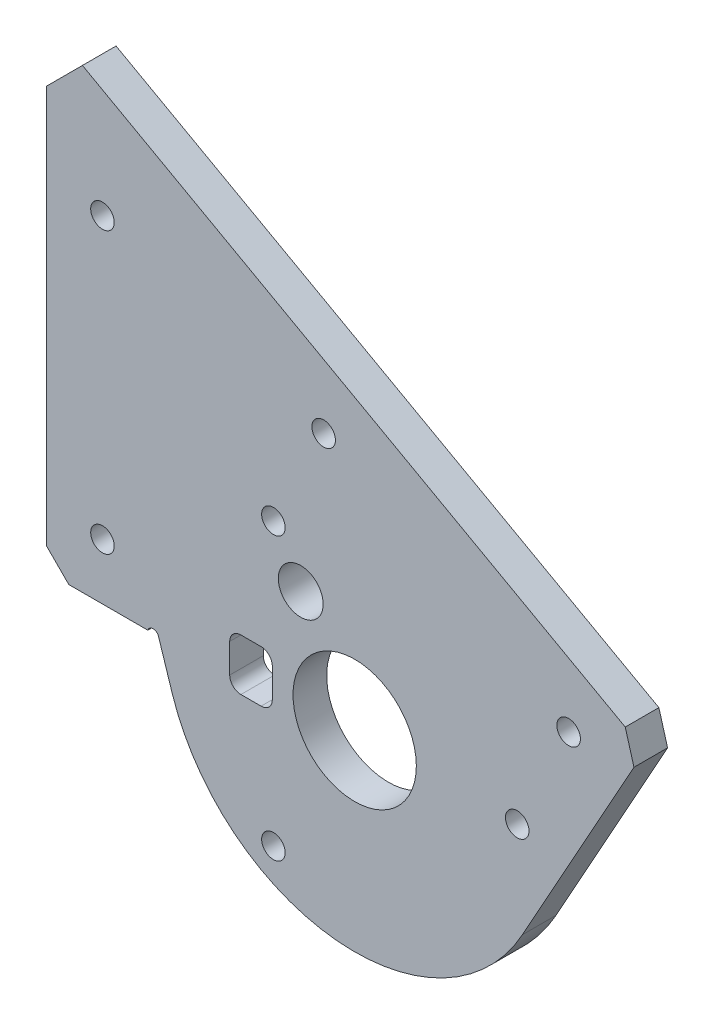
ISO-10303-21;
HEADER;
FILE_DESCRIPTION(('STEP AP214'),'2;1');
FILE_NAME('part.step','',(''),(''),'','','');
FILE_SCHEMA(('AUTOMOTIVE_DESIGN { 1 0 10303 214 1 1 1 1 }'));
ENDSEC;
DATA;
#1=APPLICATION_CONTEXT('core data for automotive mechanical design processes');
#2=APPLICATION_PROTOCOL_DEFINITION('international standard','automotive_design',2000,#1);
#3=PRODUCT_CONTEXT('',#1,'mechanical');
#4=PRODUCT('Part','Part','',(#3));
#5=PRODUCT_RELATED_PRODUCT_CATEGORY('part','',(#4));
#6=PRODUCT_DEFINITION_FORMATION('','',#4);
#7=PRODUCT_DEFINITION_CONTEXT('part definition',#1,'design');
#8=PRODUCT_DEFINITION('design','',#6,#7);
#9=PRODUCT_DEFINITION_SHAPE('','',#8);
#10=(LENGTH_UNIT() NAMED_UNIT(*) SI_UNIT(.MILLI.,.METRE.));
#11=(NAMED_UNIT(*) PLANE_ANGLE_UNIT() SI_UNIT($,.RADIAN.));
#12=(NAMED_UNIT(*) SI_UNIT($,.STERADIAN.) SOLID_ANGLE_UNIT());
#13=UNCERTAINTY_MEASURE_WITH_UNIT(LENGTH_MEASURE(1.E-05),#10,'distance_accuracy_value','');
#14=(GEOMETRIC_REPRESENTATION_CONTEXT(3) GLOBAL_UNCERTAINTY_ASSIGNED_CONTEXT((#13)) GLOBAL_UNIT_ASSIGNED_CONTEXT((#10,
#11,#12)) REPRESENTATION_CONTEXT('',''));
#15=CARTESIAN_POINT('',(0.,0.,0.));
#16=DIRECTION('',(0.,0.,1.));
#17=DIRECTION('',(1.,0.,0.));
#18=AXIS2_PLACEMENT_3D('',#15,#16,#17);
#19=CARTESIAN_POINT('',(0.,0.,3.));
#20=DIRECTION('',(0.,0.,1.));
#21=DIRECTION('',(1.,0.,0.));
#22=AXIS2_PLACEMENT_3D('',#19,#20,#21);
#23=PLANE('',#22);
#24=CARTESIAN_POINT('',(-5.53786808653646,43.115155040803,3.));
#25=DIRECTION('',(0.,0.,1.));
#26=DIRECTION('',(1.,0.,0.));
#27=AXIS2_PLACEMENT_3D('',#24,#25,#26);
#28=CIRCLE('',#27,2.1);
#29=CARTESIAN_POINT('',(-3.43786808653646,43.115155040803,3.));
#30=VERTEX_POINT('',#29);
#31=EDGE_CURVE('E406',#30,#30,#28,.T.);
#32=ORIENTED_EDGE('',*,*,#31,.F.);
#33=EDGE_LOOP('',(#32));
#34=FACE_BOUND('',#33,.T.);
#35=CARTESIAN_POINT('',(38.1699957195404,18.8330084818714,3.));
#36=DIRECTION('',(0.,0.,1.));
#37=DIRECTION('',(1.,0.,0.));
#38=AXIS2_PLACEMENT_3D('',#35,#36,#37);
#39=CIRCLE('',#38,2.1);
#40=CARTESIAN_POINT('',(40.2699957195404,18.8330084818714,3.));
#41=VERTEX_POINT('',#40);
#42=EDGE_CURVE('E420',#41,#41,#39,.T.);
#43=ORIENTED_EDGE('',*,*,#42,.F.);
#44=EDGE_LOOP('',(#43));
#45=FACE_BOUND('',#44,.T.);
#46=DIRECTION('',(0.,1.,0.));
#47=VECTOR('',#46,1.);
#48=CARTESIAN_POINT('',(-14.7,-4.6,3.));
#49=LINE('',#48,#47);
#50=CARTESIAN_POINT('',(-14.7,-2.6,3.));
#51=VERTEX_POINT('',#50);
#52=CARTESIAN_POINT('',(-14.7,2.6,3.));
#53=VERTEX_POINT('',#52);
#54=EDGE_CURVE('E402',#51,#53,#49,.T.);
#55=ORIENTED_EDGE('',*,*,#54,.F.);
#56=CARTESIAN_POINT('',(-16.7,-2.6,3.));
#57=DIRECTION('',(0.,0.,1.));
#58=DIRECTION('',(1.,0.,0.));
#59=AXIS2_PLACEMENT_3D('',#56,#57,#58);
#60=CIRCLE('',#59,2.);
#61=CARTESIAN_POINT('',(-16.7,-4.6,3.));
#62=VERTEX_POINT('',#61);
#63=EDGE_CURVE('E272',#51,#62,#60,.F.);
#64=ORIENTED_EDGE('',*,*,#63,.T.);
#65=DIRECTION('',(1.,0.,0.));
#66=VECTOR('',#65,1.);
#67=CARTESIAN_POINT('',(-14.7,-4.6,3.));
#68=LINE('',#67,#66);
#69=CARTESIAN_POINT('',(-20.3,-4.6,3.));
#70=VERTEX_POINT('',#69);
#71=EDGE_CURVE('E384',#70,#62,#68,.T.);
#72=ORIENTED_EDGE('',*,*,#71,.F.);
#73=CARTESIAN_POINT('',(-20.3,-2.6,3.));
#74=DIRECTION('',(0.,0.,1.));
#75=DIRECTION('',(1.,0.,0.));
#76=AXIS2_PLACEMENT_3D('',#73,#74,#75);
#77=CIRCLE('',#76,2.);
#78=CARTESIAN_POINT('',(-22.3,-2.6,3.));
#79=VERTEX_POINT('',#78);
#80=EDGE_CURVE('E268',#70,#79,#77,.F.);
#81=ORIENTED_EDGE('',*,*,#80,.T.);
#82=DIRECTION('',(0.,-1.,0.));
#83=VECTOR('',#82,1.);
#84=CARTESIAN_POINT('',(-22.3,-4.6,3.));
#85=LINE('',#84,#83);
#86=CARTESIAN_POINT('',(-22.3,2.6,3.));
#87=VERTEX_POINT('',#86);
#88=EDGE_CURVE('E407',#87,#79,#85,.T.);
#89=ORIENTED_EDGE('',*,*,#88,.F.);
#90=CARTESIAN_POINT('',(-20.3,2.6,3.));
#91=DIRECTION('',(0.,0.,1.));
#92=DIRECTION('',(1.,0.,0.));
#93=AXIS2_PLACEMENT_3D('',#90,#91,#92);
#94=CIRCLE('',#93,2.);
#95=CARTESIAN_POINT('',(-20.3,4.6,3.));
#96=VERTEX_POINT('',#95);
#97=EDGE_CURVE('E276',#87,#96,#94,.F.);
#98=ORIENTED_EDGE('',*,*,#97,.T.);
#99=DIRECTION('',(-1.,0.,0.));
#100=VECTOR('',#99,1.);
#101=CARTESIAN_POINT('',(-14.7,4.6,3.));
#102=LINE('',#101,#100);
#103=CARTESIAN_POINT('',(-16.7,4.6,3.));
#104=VERTEX_POINT('',#103);
#105=EDGE_CURVE('E405',#104,#96,#102,.T.);
#106=ORIENTED_EDGE('',*,*,#105,.F.);
#107=CARTESIAN_POINT('',(-16.7,2.6,3.));
#108=DIRECTION('',(0.,0.,1.));
#109=DIRECTION('',(1.,0.,0.));
#110=AXIS2_PLACEMENT_3D('',#107,#108,#109);
#111=CIRCLE('',#110,2.);
#112=EDGE_CURVE('E280',#104,#53,#111,.F.);
#113=ORIENTED_EDGE('',*,*,#112,.T.);
#114=EDGE_LOOP('',(#55,#64,#72,#81,#89,#98,#106,#113));
#115=FACE_BOUND('',#114,.T.);
#116=DIRECTION('',(-0.874157276121538,0.485642931178632,0.));
#117=VECTOR('',#116,1.);
#118=CARTESIAN_POINT('',(51.7679977925421,22.7181519313005,3.));
#119=LINE('',#118,#117);
#120=CARTESIAN_POINT('',(48.271368688056,24.660723656015,3.));
#121=VERTEX_POINT('',#120);
#122=CARTESIAN_POINT('',(-48.5714285714286,78.462277689062,3.));
#123=VERTEX_POINT('',#122);
#124=EDGE_CURVE('E217',#121,#123,#119,.T.);
#125=ORIENTED_EDGE('',*,*,#124,.T.);
#126=DIRECTION('',(0.707106781186547,0.707106781186548,0.));
#127=VECTOR('',#126,1.);
#128=CARTESIAN_POINT('',(-63.5168531302453,63.5168531302452,3.));
#129=LINE('',#128,#127);
#130=CARTESIAN_POINT('',(-55.,72.0337062604905,3.));
#131=VERTEX_POINT('',#130);
#132=EDGE_CURVE('E247',#123,#131,#129,.F.);
#133=ORIENTED_EDGE('',*,*,#132,.T.);
#134=DIRECTION('',(0.,-1.,0.));
#135=VECTOR('',#134,1.);
#136=CARTESIAN_POINT('',(-55.,82.0337062604906,3.));
#137=LINE('',#136,#135);
#138=CARTESIAN_POINT('',(-55.,1.0337062604906,3.));
#139=VERTEX_POINT('',#138);
#140=EDGE_CURVE('E195',#131,#139,#137,.T.);
#141=ORIENTED_EDGE('',*,*,#140,.T.);
#142=DIRECTION('',(-0.707106781186546,0.707106781186549,0.));
#143=VECTOR('',#142,1.);
#144=CARTESIAN_POINT('',(-26.9831468697548,-26.9831468697547,3.));
#145=LINE('',#144,#143);
#146=CARTESIAN_POINT('',(-51.,-2.96629373950943,3.));
#147=VERTEX_POINT('',#146);
#148=EDGE_CURVE('E230',#139,#147,#145,.F.);
#149=ORIENTED_EDGE('',*,*,#148,.T.);
#150=DIRECTION('',(1.,0.,0.));
#151=VECTOR('',#150,1.);
#152=CARTESIAN_POINT('',(-55.,-2.96629373950943,3.));
#153=LINE('',#152,#151);
#154=CARTESIAN_POINT('',(-36.9034172355211,-2.96629373950943,3.));
#155=VERTEX_POINT('',#154);
#156=EDGE_CURVE('E185',#147,#155,#153,.T.);
#157=ORIENTED_EDGE('',*,*,#156,.T.);
#158=CARTESIAN_POINT('',(-35.9517086177605,-3.27329651943219,3.));
#159=DIRECTION('',(0.,0.,1.));
#160=DIRECTION('',(1.,0.,0.));
#161=AXIS2_PLACEMENT_3D('',#158,#159,#160);
#162=CIRCLE('',#161,0.999999999999998);
#163=CARTESIAN_POINT('',(-35.,-2.96629373950943,3.));
#164=VERTEX_POINT('',#163);
#165=EDGE_CURVE('E169',#164,#155,#162,.T.);
#166=ORIENTED_EDGE('',*,*,#165,.F.);
#167=DIRECTION('',(0.307002779922758,-0.951708617760551,0.));
#168=VECTOR('',#167,1.);
#169=CARTESIAN_POINT('',(-35.,-2.96629373950943,3.));
#170=LINE('',#169,#168);
#171=CARTESIAN_POINT('',(-32.5679086326559,-10.5057769782761,3.));
#172=VERTEX_POINT('',#171);
#173=EDGE_CURVE('E182',#164,#172,#170,.T.);
#174=ORIENTED_EDGE('',*,*,#173,.T.);
#175=CARTESIAN_POINT('',(0.,0.,3.));
#176=DIRECTION('',(0.,0.,1.));
#177=DIRECTION('',(1.,0.,0.));
#178=AXIS2_PLACEMENT_3D('',#175,#176,#177);
#179=CIRCLE('',#178,34.2204620457161);
#180=CARTESIAN_POINT('',(29.9140658895037,-16.6189254941687,3.));
#181=VERTEX_POINT('',#180);
#182=EDGE_CURVE('E191',#172,#181,#179,.T.);
#183=ORIENTED_EDGE('',*,*,#182,.T.);
#184=DIRECTION('',(0.485642931178632,0.874157276121538,0.));
#185=VECTOR('',#184,1.);
#186=CARTESIAN_POINT('',(29.9140658895037,-16.6189254941687,3.));
#187=LINE('',#186,#185);
#188=CARTESIAN_POINT('',(49.8254260678276,19.2215228268143,3.));
#189=VERTEX_POINT('',#188);
#190=EDGE_CURVE('E193',#181,#189,#187,.T.);
#191=ORIENTED_EDGE('',*,*,#190,.T.);
#192=DIRECTION('',(0.27472112789738,-0.961523947640823,0.));
#193=VECTOR('',#192,1.);
#194=CARTESIAN_POINT('',(51.1423999414897,14.6121142689971,3.));
#195=LINE('',#194,#193);
#196=EDGE_CURVE('E232',#189,#121,#195,.F.);
#197=ORIENTED_EDGE('',*,*,#196,.T.);
#198=EDGE_LOOP('',(#125,#133,#141,#149,#157,#166,#174,#183,#191,#197));
#199=FACE_BOUND('',#198,.T.);
#200=CARTESIAN_POINT('',(-45.,7.03370626049057,3.));
#201=DIRECTION('',(0.,0.,1.));
#202=DIRECTION('',(1.,0.,0.));
#203=AXIS2_PLACEMENT_3D('',#200,#201,#202);
#204=CIRCLE('',#203,2.1);
#205=CARTESIAN_POINT('',(-42.9,7.03370626049057,3.));
#206=VERTEX_POINT('',#205);
#207=EDGE_CURVE('E186',#206,#206,#204,.T.);
#208=ORIENTED_EDGE('',*,*,#207,.F.);
#209=EDGE_LOOP('',(#208));
#210=FACE_BOUND('',#209,.T.);
#211=CARTESIAN_POINT('',(-45.,57.0337062604906,3.));
#212=DIRECTION('',(0.,0.,1.));
#213=DIRECTION('',(1.,0.,0.));
#214=AXIS2_PLACEMENT_3D('',#211,#212,#213);
#215=CIRCLE('',#214,2.1);
#216=CARTESIAN_POINT('',(-42.9,57.0337062604906,3.));
#217=VERTEX_POINT('',#216);
#218=EDGE_CURVE('E389',#217,#217,#215,.T.);
#219=ORIENTED_EDGE('',*,*,#218,.F.);
#220=EDGE_LOOP('',(#219));
#221=FACE_BOUND('',#220,.T.);
#222=CARTESIAN_POINT('',(-9.62500000000001,16.6709890228504,3.));
#223=DIRECTION('',(0.,0.,1.));
#224=DIRECTION('',(1.,0.,0.));
#225=AXIS2_PLACEMENT_3D('',#222,#223,#224);
#226=CIRCLE('',#225,4.);
#227=CARTESIAN_POINT('',(-5.62500000000001,16.6709890228504,3.));
#228=VERTEX_POINT('',#227);
#229=EDGE_CURVE('E353',#228,#228,#226,.T.);
#230=ORIENTED_EDGE('',*,*,#229,.F.);
#231=EDGE_LOOP('',(#230));
#232=FACE_BOUND('',#231,.T.);
#233=CARTESIAN_POINT('',(-14.5,-25.1147367097487,3.));
#234=DIRECTION('',(0.,0.,1.));
#235=DIRECTION('',(1.,0.,0.));
#236=AXIS2_PLACEMENT_3D('',#233,#234,#235);
#237=CIRCLE('',#236,2.1);
#238=CARTESIAN_POINT('',(-12.4,-25.1147367097487,3.));
#239=VERTEX_POINT('',#238);
#240=EDGE_CURVE('E361',#239,#239,#237,.T.);
#241=ORIENTED_EDGE('',*,*,#240,.F.);
#242=EDGE_LOOP('',(#241));
#243=FACE_BOUND('',#242,.T.);
#244=CARTESIAN_POINT('',(29.,0.,3.));
#245=DIRECTION('',(0.,0.,1.));
#246=DIRECTION('',(1.,0.,0.));
#247=AXIS2_PLACEMENT_3D('',#244,#245,#246);
#248=CIRCLE('',#247,2.1);
#249=CARTESIAN_POINT('',(31.1,0.,3.));
#250=VERTEX_POINT('',#249);
#251=EDGE_CURVE('E206',#250,#250,#248,.T.);
#252=ORIENTED_EDGE('',*,*,#251,.F.);
#253=EDGE_LOOP('',(#252));
#254=FACE_BOUND('',#253,.T.);
#255=CARTESIAN_POINT('',(-14.5,25.1147367097487,3.));
#256=DIRECTION('',(0.,0.,1.));
#257=DIRECTION('',(1.,0.,0.));
#258=AXIS2_PLACEMENT_3D('',#255,#256,#257);
#259=CIRCLE('',#258,2.1);
#260=CARTESIAN_POINT('',(-12.4,25.1147367097487,3.));
#261=VERTEX_POINT('',#260);
#262=EDGE_CURVE('E357',#261,#261,#259,.T.);
#263=ORIENTED_EDGE('',*,*,#262,.F.);
#264=EDGE_LOOP('',(#263));
#265=FACE_BOUND('',#264,.T.);
#266=CARTESIAN_POINT('',(0.,0.,3.));
#267=DIRECTION('',(0.,0.,1.));
#268=DIRECTION('',(1.,0.,0.));
#269=AXIS2_PLACEMENT_3D('',#266,#267,#268);
#270=CIRCLE('',#269,11.);
#271=CARTESIAN_POINT('',(11.,0.,3.));
#272=VERTEX_POINT('',#271);
#273=EDGE_CURVE('E346',#272,#272,#270,.T.);
#274=ORIENTED_EDGE('',*,*,#273,.F.);
#275=EDGE_LOOP('',(#274));
#276=FACE_BOUND('',#275,.T.);
#277=ADVANCED_FACE('F37',(#34,#45,#115,#199,#210,#221,#232,#243,#254,#265,#276),#23,.T.);
#278=CARTESIAN_POINT('',(0.,0.,-3.));
#279=DIRECTION('',(0.,0.,1.));
#280=DIRECTION('',(1.,0.,0.));
#281=AXIS2_PLACEMENT_3D('',#278,#279,#280);
#282=PLANE('',#281);
#283=CARTESIAN_POINT('',(38.1699957195404,18.8330084818714,-3.));
#284=DIRECTION('',(0.,0.,1.));
#285=DIRECTION('',(1.,0.,0.));
#286=AXIS2_PLACEMENT_3D('',#283,#284,#285);
#287=CIRCLE('',#286,4.10000000000003);
#288=CARTESIAN_POINT('',(42.2699957195405,18.8330084818714,-3.));
#289=VERTEX_POINT('',#288);
#290=EDGE_CURVE('E292',#289,#289,#287,.T.);
#291=ORIENTED_EDGE('',*,*,#290,.T.);
#292=EDGE_LOOP('',(#291));
#293=FACE_BOUND('',#292,.T.);
#294=CARTESIAN_POINT('',(-5.53786808653646,43.115155040803,-3.));
#295=DIRECTION('',(0.,0.,1.));
#296=DIRECTION('',(1.,0.,0.));
#297=AXIS2_PLACEMENT_3D('',#294,#295,#296);
#298=CIRCLE('',#297,4.09999999999999);
#299=CARTESIAN_POINT('',(-1.43786808653647,43.115155040803,-3.));
#300=VERTEX_POINT('',#299);
#301=EDGE_CURVE('E289',#300,#300,#298,.T.);
#302=ORIENTED_EDGE('',*,*,#301,.T.);
#303=EDGE_LOOP('',(#302));
#304=FACE_BOUND('',#303,.T.);
#305=CARTESIAN_POINT('',(-45.,7.03370626049057,-3.));
#306=DIRECTION('',(0.,0.,1.));
#307=DIRECTION('',(1.,0.,0.));
#308=AXIS2_PLACEMENT_3D('',#305,#306,#307);
#309=CIRCLE('',#308,4.09999999999999);
#310=CARTESIAN_POINT('',(-40.9,7.03370626049057,-3.));
#311=VERTEX_POINT('',#310);
#312=EDGE_CURVE('E286',#311,#311,#309,.T.);
#313=ORIENTED_EDGE('',*,*,#312,.T.);
#314=EDGE_LOOP('',(#313));
#315=FACE_BOUND('',#314,.T.);
#316=CARTESIAN_POINT('',(-45.,57.0337062604906,-3.));
#317=DIRECTION('',(0.,0.,1.));
#318=DIRECTION('',(1.,0.,0.));
#319=AXIS2_PLACEMENT_3D('',#316,#317,#318);
#320=CIRCLE('',#319,4.09999999999999);
#321=CARTESIAN_POINT('',(-40.9,57.0337062604906,-3.));
#322=VERTEX_POINT('',#321);
#323=EDGE_CURVE('E283',#322,#322,#320,.T.);
#324=ORIENTED_EDGE('',*,*,#323,.T.);
#325=EDGE_LOOP('',(#324));
#326=FACE_BOUND('',#325,.T.);
#327=DIRECTION('',(0.,-1.,0.));
#328=VECTOR('',#327,1.);
#329=CARTESIAN_POINT('',(-22.3,-4.6,-3.));
#330=LINE('',#329,#328);
#331=CARTESIAN_POINT('',(-22.3,2.6,-3.));
#332=VERTEX_POINT('',#331);
#333=CARTESIAN_POINT('',(-22.3,-2.6,-3.));
#334=VERTEX_POINT('',#333);
#335=EDGE_CURVE('E322',#332,#334,#330,.T.);
#336=ORIENTED_EDGE('',*,*,#335,.T.);
#337=CARTESIAN_POINT('',(-20.3,-2.6,-3.));
#338=DIRECTION('',(0.,0.,1.));
#339=DIRECTION('',(1.,0.,0.));
#340=AXIS2_PLACEMENT_3D('',#337,#338,#339);
#341=CIRCLE('',#340,2.);
#342=CARTESIAN_POINT('',(-20.3,-4.6,-3.));
#343=VERTEX_POINT('',#342);
#344=EDGE_CURVE('E270',#334,#343,#341,.T.);
#345=ORIENTED_EDGE('',*,*,#344,.T.);
#346=DIRECTION('',(1.,0.,0.));
#347=VECTOR('',#346,1.);
#348=CARTESIAN_POINT('',(-14.7,-4.6,-3.));
#349=LINE('',#348,#347);
#350=CARTESIAN_POINT('',(-16.7,-4.6,-3.));
#351=VERTEX_POINT('',#350);
#352=EDGE_CURVE('E391',#343,#351,#349,.T.);
#353=ORIENTED_EDGE('',*,*,#352,.T.);
#354=CARTESIAN_POINT('',(-16.7,-2.6,-3.));
#355=DIRECTION('',(0.,0.,1.));
#356=DIRECTION('',(1.,0.,0.));
#357=AXIS2_PLACEMENT_3D('',#354,#355,#356);
#358=CIRCLE('',#357,2.);
#359=CARTESIAN_POINT('',(-14.7,-2.6,-3.));
#360=VERTEX_POINT('',#359);
#361=EDGE_CURVE('E274',#351,#360,#358,.T.);
#362=ORIENTED_EDGE('',*,*,#361,.T.);
#363=DIRECTION('',(0.,1.,0.));
#364=VECTOR('',#363,1.);
#365=CARTESIAN_POINT('',(-14.7,-4.6,-3.));
#366=LINE('',#365,#364);
#367=CARTESIAN_POINT('',(-14.7,2.6,-3.));
#368=VERTEX_POINT('',#367);
#369=EDGE_CURVE('E413',#360,#368,#366,.T.);
#370=ORIENTED_EDGE('',*,*,#369,.T.);
#371=CARTESIAN_POINT('',(-16.7,2.6,-3.));
#372=DIRECTION('',(0.,0.,1.));
#373=DIRECTION('',(1.,0.,0.));
#374=AXIS2_PLACEMENT_3D('',#371,#372,#373);
#375=CIRCLE('',#374,2.);
#376=CARTESIAN_POINT('',(-16.7,4.6,-3.));
#377=VERTEX_POINT('',#376);
#378=EDGE_CURVE('E60',#368,#377,#375,.T.);
#379=ORIENTED_EDGE('',*,*,#378,.T.);
#380=DIRECTION('',(-1.,0.,0.));
#381=VECTOR('',#380,1.);
#382=CARTESIAN_POINT('',(-14.7,4.6,-3.));
#383=LINE('',#382,#381);
#384=CARTESIAN_POINT('',(-20.3,4.6,-3.));
#385=VERTEX_POINT('',#384);
#386=EDGE_CURVE('E398',#377,#385,#383,.T.);
#387=ORIENTED_EDGE('',*,*,#386,.T.);
#388=CARTESIAN_POINT('',(-20.3,2.6,-3.));
#389=DIRECTION('',(0.,0.,1.));
#390=DIRECTION('',(1.,0.,0.));
#391=AXIS2_PLACEMENT_3D('',#388,#389,#390);
#392=CIRCLE('',#391,2.);
#393=EDGE_CURVE('E278',#385,#332,#392,.T.);
#394=ORIENTED_EDGE('',*,*,#393,.T.);
#395=EDGE_LOOP('',(#336,#345,#353,#362,#370,#379,#387,#394));
#396=FACE_BOUND('',#395,.T.);
#397=DIRECTION('',(0.,-1.,0.));
#398=VECTOR('',#397,1.);
#399=CARTESIAN_POINT('',(-55.,82.0337062604906,-3.));
#400=LINE('',#399,#398);
#401=CARTESIAN_POINT('',(-55.,72.0337062604905,-3.));
#402=VERTEX_POINT('',#401);
#403=CARTESIAN_POINT('',(-55.,1.0337062604906,-3.));
#404=VERTEX_POINT('',#403);
#405=EDGE_CURVE('E205',#402,#404,#400,.T.);
#406=ORIENTED_EDGE('',*,*,#405,.F.);
#407=DIRECTION('',(-0.707106781186547,-0.707106781186548,0.));
#408=VECTOR('',#407,1.);
#409=CARTESIAN_POINT('',(-55.,72.0337062604905,-3.));
#410=LINE('',#409,#408);
#411=CARTESIAN_POINT('',(-48.5714285714286,78.462277689062,-3.));
#412=VERTEX_POINT('',#411);
#413=EDGE_CURVE('E243',#402,#412,#410,.F.);
#414=ORIENTED_EDGE('',*,*,#413,.T.);
#415=DIRECTION('',(-0.874157276121538,0.485642931178632,0.));
#416=VECTOR('',#415,1.);
#417=CARTESIAN_POINT('',(51.7679977925421,22.7181519313005,-3.));
#418=LINE('',#417,#416);
#419=CARTESIAN_POINT('',(48.271368688056,24.660723656015,-3.));
#420=VERTEX_POINT('',#419);
#421=EDGE_CURVE('E202',#420,#412,#418,.T.);
#422=ORIENTED_EDGE('',*,*,#421,.F.);
#423=DIRECTION('',(-0.27472112789738,0.961523947640823,0.));
#424=VECTOR('',#423,1.);
#425=CARTESIAN_POINT('',(48.271368688056,24.660723656015,-3.));
#426=LINE('',#425,#424);
#427=CARTESIAN_POINT('',(49.8254260678276,19.2215228268143,-3.));
#428=VERTEX_POINT('',#427);
#429=EDGE_CURVE('E226',#420,#428,#426,.F.);
#430=ORIENTED_EDGE('',*,*,#429,.T.);
#431=DIRECTION('',(0.485642931178632,0.874157276121538,0.));
#432=VECTOR('',#431,1.);
#433=CARTESIAN_POINT('',(29.9140658895037,-16.6189254941687,-3.));
#434=LINE('',#433,#432);
#435=CARTESIAN_POINT('',(29.9140658895037,-16.6189254941687,-3.));
#436=VERTEX_POINT('',#435);
#437=EDGE_CURVE('E214',#436,#428,#434,.T.);
#438=ORIENTED_EDGE('',*,*,#437,.F.);
#439=CARTESIAN_POINT('',(0.,0.,-3.));
#440=DIRECTION('',(0.,0.,1.));
#441=DIRECTION('',(1.,0.,0.));
#442=AXIS2_PLACEMENT_3D('',#439,#440,#441);
#443=CIRCLE('',#442,34.2204620457161);
#444=CARTESIAN_POINT('',(-32.5679086326559,-10.5057769782761,-3.));
#445=VERTEX_POINT('',#444);
#446=EDGE_CURVE('E212',#445,#436,#443,.T.);
#447=ORIENTED_EDGE('',*,*,#446,.F.);
#448=DIRECTION('',(0.307002779922758,-0.951708617760551,0.));
#449=VECTOR('',#448,1.);
#450=CARTESIAN_POINT('',(-35.,-2.96629373950943,-3.));
#451=LINE('',#450,#449);
#452=CARTESIAN_POINT('',(-35.,-2.96629373950943,-3.));
#453=VERTEX_POINT('',#452);
#454=EDGE_CURVE('E210',#453,#445,#451,.T.);
#455=ORIENTED_EDGE('',*,*,#454,.F.);
#456=CARTESIAN_POINT('',(-35.9517086177605,-3.27329651943219,-3.));
#457=DIRECTION('',(0.,0.,1.));
#458=DIRECTION('',(1.,0.,0.));
#459=AXIS2_PLACEMENT_3D('',#456,#457,#458);
#460=CIRCLE('',#459,0.999999999999998);
#461=CARTESIAN_POINT('',(-36.9034172355211,-2.96629373950943,-3.));
#462=VERTEX_POINT('',#461);
#463=EDGE_CURVE('E172',#453,#462,#460,.T.);
#464=ORIENTED_EDGE('',*,*,#463,.T.);
#465=DIRECTION('',(1.,0.,0.));
#466=VECTOR('',#465,1.);
#467=CARTESIAN_POINT('',(-55.,-2.96629373950943,-3.));
#468=LINE('',#467,#466);
#469=CARTESIAN_POINT('',(-51.,-2.96629373950943,-3.));
#470=VERTEX_POINT('',#469);
#471=EDGE_CURVE('E208',#470,#462,#468,.T.);
#472=ORIENTED_EDGE('',*,*,#471,.F.);
#473=DIRECTION('',(0.707106781186546,-0.707106781186549,0.));
#474=VECTOR('',#473,1.);
#475=CARTESIAN_POINT('',(-51.,-2.96629373950943,-3.));
#476=LINE('',#475,#474);
#477=EDGE_CURVE('E223',#470,#404,#476,.F.);
#478=ORIENTED_EDGE('',*,*,#477,.T.);
#479=EDGE_LOOP('',(#406,#414,#422,#430,#438,#447,#455,#464,#472,#478));
#480=FACE_BOUND('',#479,.T.);
#481=CARTESIAN_POINT('',(29.,0.,-3.));
#482=DIRECTION('',(0.,0.,1.));
#483=DIRECTION('',(1.,0.,0.));
#484=AXIS2_PLACEMENT_3D('',#481,#482,#483);
#485=CIRCLE('',#484,2.1);
#486=CARTESIAN_POINT('',(31.1,0.,-3.));
#487=VERTEX_POINT('',#486);
#488=EDGE_CURVE('E329',#487,#487,#485,.T.);
#489=ORIENTED_EDGE('',*,*,#488,.T.);
#490=EDGE_LOOP('',(#489));
#491=FACE_BOUND('',#490,.T.);
#492=CARTESIAN_POINT('',(-14.5,-25.1147367097487,-3.));
#493=DIRECTION('',(0.,0.,1.));
#494=DIRECTION('',(1.,0.,0.));
#495=AXIS2_PLACEMENT_3D('',#492,#493,#494);
#496=CIRCLE('',#495,2.1);
#497=CARTESIAN_POINT('',(-12.4,-25.1147367097487,-3.));
#498=VERTEX_POINT('',#497);
#499=EDGE_CURVE('E333',#498,#498,#496,.T.);
#500=ORIENTED_EDGE('',*,*,#499,.T.);
#501=EDGE_LOOP('',(#500));
#502=FACE_BOUND('',#501,.T.);
#503=CARTESIAN_POINT('',(-14.5,25.1147367097487,-3.));
#504=DIRECTION('',(0.,0.,1.));
#505=DIRECTION('',(1.,0.,0.));
#506=AXIS2_PLACEMENT_3D('',#503,#504,#505);
#507=CIRCLE('',#506,2.1);
#508=CARTESIAN_POINT('',(-12.4,25.1147367097487,-3.));
#509=VERTEX_POINT('',#508);
#510=EDGE_CURVE('E337',#509,#509,#507,.T.);
#511=ORIENTED_EDGE('',*,*,#510,.T.);
#512=EDGE_LOOP('',(#511));
#513=FACE_BOUND('',#512,.T.);
#514=CARTESIAN_POINT('',(-9.62500000000001,16.6709890228504,-3.));
#515=DIRECTION('',(0.,0.,1.));
#516=DIRECTION('',(1.,0.,0.));
#517=AXIS2_PLACEMENT_3D('',#514,#515,#516);
#518=CIRCLE('',#517,4.);
#519=CARTESIAN_POINT('',(-5.62500000000001,16.6709890228504,-3.));
#520=VERTEX_POINT('',#519);
#521=EDGE_CURVE('E341',#520,#520,#518,.T.);
#522=ORIENTED_EDGE('',*,*,#521,.T.);
#523=EDGE_LOOP('',(#522));
#524=FACE_BOUND('',#523,.T.);
#525=CARTESIAN_POINT('',(0.,0.,-3.));
#526=DIRECTION('',(0.,0.,1.));
#527=DIRECTION('',(1.,0.,0.));
#528=AXIS2_PLACEMENT_3D('',#525,#526,#527);
#529=CIRCLE('',#528,11.);
#530=CARTESIAN_POINT('',(11.,0.,-3.));
#531=VERTEX_POINT('',#530);
#532=EDGE_CURVE('E344',#531,#531,#529,.T.);
#533=ORIENTED_EDGE('',*,*,#532,.T.);
#534=EDGE_LOOP('',(#533));
#535=FACE_BOUND('',#534,.T.);
#536=ADVANCED_FACE('F312',(#293,#304,#315,#326,#396,#480,#491,#502,#513,#524,#535),#282,.F.);
#537=CARTESIAN_POINT('',(51.7679977925421,22.7181519313005,3.));
#538=DIRECTION('',(-0.485642931178632,-0.874157276121538,0.));
#539=DIRECTION('',(0.874157276121538,-0.485642931178632,0.));
#540=AXIS2_PLACEMENT_3D('',#537,#538,#539);
#541=PLANE('',#540);
#542=ORIENTED_EDGE('',*,*,#421,.T.);
#543=DIRECTION('',(0.,0.,1.));
#544=VECTOR('',#543,1.);
#545=CARTESIAN_POINT('',(-48.5714285714286,78.462277689062,3.));
#546=LINE('',#545,#544);
#547=EDGE_CURVE('E245',#412,#123,#546,.T.);
#548=ORIENTED_EDGE('',*,*,#547,.T.);
#549=ORIENTED_EDGE('',*,*,#124,.F.);
#550=DIRECTION('',(0.,0.,-1.));
#551=VECTOR('',#550,1.);
#552=CARTESIAN_POINT('',(48.271368688056,24.660723656015,3.));
#553=LINE('',#552,#551);
#554=EDGE_CURVE('E176',#121,#420,#553,.T.);
#555=ORIENTED_EDGE('',*,*,#554,.T.);
#556=EDGE_LOOP('',(#542,#548,#549,#555));
#557=FACE_BOUND('',#556,.T.);
#558=ADVANCED_FACE('F315',(#557),#541,.F.);
#559=CARTESIAN_POINT('',(-55.,82.0337062604906,3.));
#560=DIRECTION('',(1.,0.,0.));
#561=DIRECTION('',(0.,1.,0.));
#562=AXIS2_PLACEMENT_3D('',#559,#560,#561);
#563=PLANE('',#562);
#564=ORIENTED_EDGE('',*,*,#140,.F.);
#565=DIRECTION('',(0.,0.,-1.));
#566=VECTOR('',#565,1.);
#567=CARTESIAN_POINT('',(-55.,72.0337062604905,3.));
#568=LINE('',#567,#566);
#569=EDGE_CURVE('E240',#131,#402,#568,.T.);
#570=ORIENTED_EDGE('',*,*,#569,.T.);
#571=ORIENTED_EDGE('',*,*,#405,.T.);
#572=DIRECTION('',(0.,0.,1.));
#573=VECTOR('',#572,1.);
#574=CARTESIAN_POINT('',(-55.,1.0337062604906,3.));
#575=LINE('',#574,#573);
#576=EDGE_CURVE('E237',#404,#139,#575,.T.);
#577=ORIENTED_EDGE('',*,*,#576,.T.);
#578=EDGE_LOOP('',(#564,#570,#571,#577));
#579=FACE_BOUND('',#578,.T.);
#580=ADVANCED_FACE('F374',(#579),#563,.F.);
#581=CARTESIAN_POINT('',(-55.,-2.96629373950943,3.));
#582=DIRECTION('',(0.,1.,0.));
#583=DIRECTION('',(-1.,0.,0.));
#584=AXIS2_PLACEMENT_3D('',#581,#582,#583);
#585=PLANE('',#584);
#586=ORIENTED_EDGE('',*,*,#156,.F.);
#587=DIRECTION('',(0.,0.,-1.));
#588=VECTOR('',#587,1.);
#589=CARTESIAN_POINT('',(-51.,-2.96629373950943,3.));
#590=LINE('',#589,#588);
#591=EDGE_CURVE('E234',#147,#470,#590,.T.);
#592=ORIENTED_EDGE('',*,*,#591,.T.);
#593=ORIENTED_EDGE('',*,*,#471,.T.);
#594=DIRECTION('',(0.,0.,1.));
#595=VECTOR('',#594,1.);
#596=CARTESIAN_POINT('',(-36.9034172355211,-2.96629373950943,-3.));
#597=LINE('',#596,#595);
#598=EDGE_CURVE('E347',#462,#155,#597,.T.);
#599=ORIENTED_EDGE('',*,*,#598,.T.);
#600=EDGE_LOOP('',(#586,#592,#593,#599));
#601=FACE_BOUND('',#600,.T.);
#602=ADVANCED_FACE('F380',(#601),#585,.F.);
#603=CARTESIAN_POINT('',(-35.,-2.96629373950943,3.));
#604=DIRECTION('',(0.951708617760551,0.307002779922758,0.));
#605=DIRECTION('',(-0.307002779922758,0.951708617760551,0.));
#606=AXIS2_PLACEMENT_3D('',#603,#604,#605);
#607=PLANE('',#606);
#608=ORIENTED_EDGE('',*,*,#454,.T.);
#609=DIRECTION('',(0.,0.,-1.));
#610=VECTOR('',#609,1.);
#611=CARTESIAN_POINT('',(-32.5679086326559,-10.5057769782761,3.));
#612=LINE('',#611,#610);
#613=EDGE_CURVE('E177',#172,#445,#612,.T.);
#614=ORIENTED_EDGE('',*,*,#613,.F.);
#615=ORIENTED_EDGE('',*,*,#173,.F.);
#616=DIRECTION('',(0.,0.,-1.));
#617=VECTOR('',#616,1.);
#618=CARTESIAN_POINT('',(-35.,-2.96629373950943,3.));
#619=LINE('',#618,#617);
#620=EDGE_CURVE('E165',#164,#453,#619,.T.);
#621=ORIENTED_EDGE('',*,*,#620,.T.);
#622=EDGE_LOOP('',(#608,#614,#615,#621));
#623=FACE_BOUND('',#622,.T.);
#624=ADVANCED_FACE('F188',(#623),#607,.F.);
#625=CARTESIAN_POINT('',(0.,0.,3.));
#626=DIRECTION('',(0.,0.,-1.));
#627=DIRECTION('',(-1.,0.,0.));
#628=AXIS2_PLACEMENT_3D('',#625,#626,#627);
#629=CYLINDRICAL_SURFACE('',#628,34.2204620457161);
#630=ORIENTED_EDGE('',*,*,#446,.T.);
#631=DIRECTION('',(0.,0.,-1.));
#632=VECTOR('',#631,1.);
#633=CARTESIAN_POINT('',(29.9140658895037,-16.6189254941687,3.));
#634=LINE('',#633,#632);
#635=EDGE_CURVE('E201',#181,#436,#634,.T.);
#636=ORIENTED_EDGE('',*,*,#635,.F.);
#637=ORIENTED_EDGE('',*,*,#182,.F.);
#638=ORIENTED_EDGE('',*,*,#613,.T.);
#639=EDGE_LOOP('',(#630,#636,#637,#638));
#640=FACE_BOUND('',#639,.T.);
#641=ADVANCED_FACE('F541',(#640),#629,.T.);
#642=CARTESIAN_POINT('',(29.9140658895037,-16.6189254941687,3.));
#643=DIRECTION('',(-0.874157276121538,0.485642931178632,0.));
#644=DIRECTION('',(-0.485642931178632,-0.874157276121538,0.));
#645=AXIS2_PLACEMENT_3D('',#642,#643,#644);
#646=PLANE('',#645);
#647=ORIENTED_EDGE('',*,*,#437,.T.);
#648=DIRECTION('',(0.,0.,1.));
#649=VECTOR('',#648,1.);
#650=CARTESIAN_POINT('',(49.8254260678276,19.2215228268143,3.));
#651=LINE('',#650,#649);
#652=EDGE_CURVE('E228',#428,#189,#651,.T.);
#653=ORIENTED_EDGE('',*,*,#652,.T.);
#654=ORIENTED_EDGE('',*,*,#190,.F.);
#655=ORIENTED_EDGE('',*,*,#635,.T.);
#656=EDGE_LOOP('',(#647,#653,#654,#655));
#657=FACE_BOUND('',#656,.T.);
#658=ADVANCED_FACE('F536',(#657),#646,.F.);
#659=CARTESIAN_POINT('',(29.,0.,3.));
#660=DIRECTION('',(0.,0.,-1.));
#661=DIRECTION('',(-1.,0.,0.));
#662=AXIS2_PLACEMENT_3D('',#659,#660,#661);
#663=CYLINDRICAL_SURFACE('',#662,2.1);
#664=ORIENTED_EDGE('',*,*,#251,.T.);
#665=EDGE_LOOP('',(#664));
#666=FACE_BOUND('',#665,.T.);
#667=ORIENTED_EDGE('',*,*,#488,.F.);
#668=EDGE_LOOP('',(#667));
#669=FACE_BOUND('',#668,.T.);
#670=ADVANCED_FACE('F533',(#666,#669),#663,.F.);
#671=CARTESIAN_POINT('',(-14.5,-25.1147367097487,3.));
#672=DIRECTION('',(0.,0.,-1.));
#673=DIRECTION('',(-1.,0.,0.));
#674=AXIS2_PLACEMENT_3D('',#671,#672,#673);
#675=CYLINDRICAL_SURFACE('',#674,2.1);
#676=ORIENTED_EDGE('',*,*,#240,.T.);
#677=EDGE_LOOP('',(#676));
#678=FACE_BOUND('',#677,.T.);
#679=ORIENTED_EDGE('',*,*,#499,.F.);
#680=EDGE_LOOP('',(#679));
#681=FACE_BOUND('',#680,.T.);
#682=ADVANCED_FACE('F529',(#678,#681),#675,.F.);
#683=CARTESIAN_POINT('',(-14.5,25.1147367097487,3.));
#684=DIRECTION('',(0.,0.,-1.));
#685=DIRECTION('',(-1.,0.,0.));
#686=AXIS2_PLACEMENT_3D('',#683,#684,#685);
#687=CYLINDRICAL_SURFACE('',#686,2.1);
#688=ORIENTED_EDGE('',*,*,#262,.T.);
#689=EDGE_LOOP('',(#688));
#690=FACE_BOUND('',#689,.T.);
#691=ORIENTED_EDGE('',*,*,#510,.F.);
#692=EDGE_LOOP('',(#691));
#693=FACE_BOUND('',#692,.T.);
#694=ADVANCED_FACE('F525',(#690,#693),#687,.F.);
#695=CARTESIAN_POINT('',(-9.62500000000001,16.6709890228504,3.));
#696=DIRECTION('',(0.,0.,-1.));
#697=DIRECTION('',(-1.,0.,0.));
#698=AXIS2_PLACEMENT_3D('',#695,#696,#697);
#699=CYLINDRICAL_SURFACE('',#698,4.);
#700=ORIENTED_EDGE('',*,*,#229,.T.);
#701=EDGE_LOOP('',(#700));
#702=FACE_BOUND('',#701,.T.);
#703=ORIENTED_EDGE('',*,*,#521,.F.);
#704=EDGE_LOOP('',(#703));
#705=FACE_BOUND('',#704,.T.);
#706=ADVANCED_FACE('F521',(#702,#705),#699,.F.);
#707=CARTESIAN_POINT('',(0.,0.,3.));
#708=DIRECTION('',(0.,0.,-1.));
#709=DIRECTION('',(-1.,0.,0.));
#710=AXIS2_PLACEMENT_3D('',#707,#708,#709);
#711=CYLINDRICAL_SURFACE('',#710,11.);
#712=ORIENTED_EDGE('',*,*,#273,.T.);
#713=EDGE_LOOP('',(#712));
#714=FACE_BOUND('',#713,.T.);
#715=ORIENTED_EDGE('',*,*,#532,.F.);
#716=EDGE_LOOP('',(#715));
#717=FACE_BOUND('',#716,.T.);
#718=ADVANCED_FACE('F512',(#714,#717),#711,.F.);
#719=CARTESIAN_POINT('',(-35.9517086177605,-3.27329651943219,-3.));
#720=DIRECTION('',(0.,0.,1.));
#721=DIRECTION('',(1.,0.,0.));
#722=AXIS2_PLACEMENT_3D('',#719,#720,#721);
#723=CYLINDRICAL_SURFACE('',#722,0.999999999999998);
#724=ORIENTED_EDGE('',*,*,#463,.F.);
#725=ORIENTED_EDGE('',*,*,#620,.F.);
#726=ORIENTED_EDGE('',*,*,#165,.T.);
#727=ORIENTED_EDGE('',*,*,#598,.F.);
#728=EDGE_LOOP('',(#724,#725,#726,#727));
#729=FACE_BOUND('',#728,.T.);
#730=ADVANCED_FACE('F167',(#729),#723,.F.);
#731=CARTESIAN_POINT('',(-45.,57.0337062604906,-3.));
#732=DIRECTION('',(0.,0.,1.));
#733=DIRECTION('',(1.,0.,0.));
#734=AXIS2_PLACEMENT_3D('',#731,#732,#733);
#735=CYLINDRICAL_SURFACE('',#734,2.1);
#736=CARTESIAN_POINT('',(-45.,57.0337062604906,-1.00000000000001));
#737=DIRECTION('',(0.,0.,1.));
#738=DIRECTION('',(1.,0.,0.));
#739=AXIS2_PLACEMENT_3D('',#736,#737,#738);
#740=CIRCLE('',#739,2.1);
#741=CARTESIAN_POINT('',(-42.9,57.0337062604906,-1.00000000000001));
#742=VERTEX_POINT('',#741);
#743=EDGE_CURVE('E11',#742,#742,#740,.F.);
#744=ORIENTED_EDGE('',*,*,#743,.T.);
#745=EDGE_LOOP('',(#744));
#746=FACE_BOUND('',#745,.T.);
#747=ORIENTED_EDGE('',*,*,#218,.T.);
#748=EDGE_LOOP('',(#747));
#749=FACE_BOUND('',#748,.T.);
#750=ADVANCED_FACE('F511',(#746,#749),#735,.F.);
#751=CARTESIAN_POINT('',(-45.,7.03370626049057,-3.));
#752=DIRECTION('',(0.,0.,1.));
#753=DIRECTION('',(1.,0.,0.));
#754=AXIS2_PLACEMENT_3D('',#751,#752,#753);
#755=CYLINDRICAL_SURFACE('',#754,2.1);
#756=CARTESIAN_POINT('',(-45.,7.03370626049057,-1.00000000000001));
#757=DIRECTION('',(0.,0.,1.));
#758=DIRECTION('',(1.,0.,0.));
#759=AXIS2_PLACEMENT_3D('',#756,#757,#758);
#760=CIRCLE('',#759,2.1);
#761=CARTESIAN_POINT('',(-42.9,7.03370626049057,-1.00000000000001));
#762=VERTEX_POINT('',#761);
#763=EDGE_CURVE('E46',#762,#762,#760,.F.);
#764=ORIENTED_EDGE('',*,*,#763,.T.);
#765=EDGE_LOOP('',(#764));
#766=FACE_BOUND('',#765,.T.);
#767=ORIENTED_EDGE('',*,*,#207,.T.);
#768=EDGE_LOOP('',(#767));
#769=FACE_BOUND('',#768,.T.);
#770=ADVANCED_FACE('F303',(#766,#769),#755,.F.);
#771=CARTESIAN_POINT('',(48.271368688056,24.660723656015,3.));
#772=DIRECTION('',(-0.961523947640823,-0.27472112789738,0.));
#773=DIRECTION('',(0.,0.,-1.));
#774=AXIS2_PLACEMENT_3D('',#771,#772,#773);
#775=PLANE('',#774);
#776=ORIENTED_EDGE('',*,*,#196,.F.);
#777=ORIENTED_EDGE('',*,*,#652,.F.);
#778=ORIENTED_EDGE('',*,*,#429,.F.);
#779=ORIENTED_EDGE('',*,*,#554,.F.);
#780=EDGE_LOOP('',(#776,#777,#778,#779));
#781=FACE_BOUND('',#780,.T.);
#782=ADVANCED_FACE('F515',(#781),#775,.F.);
#783=CARTESIAN_POINT('',(-51.,-2.96629373950943,3.));
#784=DIRECTION('',(0.707106781186549,0.707106781186546,0.));
#785=DIRECTION('',(0.,0.,-1.));
#786=AXIS2_PLACEMENT_3D('',#783,#784,#785);
#787=PLANE('',#786);
#788=ORIENTED_EDGE('',*,*,#148,.F.);
#789=ORIENTED_EDGE('',*,*,#576,.F.);
#790=ORIENTED_EDGE('',*,*,#477,.F.);
#791=ORIENTED_EDGE('',*,*,#591,.F.);
#792=EDGE_LOOP('',(#788,#789,#790,#791));
#793=FACE_BOUND('',#792,.T.);
#794=ADVANCED_FACE('F377',(#793),#787,.F.);
#795=CARTESIAN_POINT('',(-55.,72.0337062604905,3.));
#796=DIRECTION('',(0.707106781186548,-0.707106781186547,0.));
#797=DIRECTION('',(0.,0.,-1.));
#798=AXIS2_PLACEMENT_3D('',#795,#796,#797);
#799=PLANE('',#798);
#800=ORIENTED_EDGE('',*,*,#132,.F.);
#801=ORIENTED_EDGE('',*,*,#547,.F.);
#802=ORIENTED_EDGE('',*,*,#413,.F.);
#803=ORIENTED_EDGE('',*,*,#569,.F.);
#804=EDGE_LOOP('',(#800,#801,#802,#803));
#805=FACE_BOUND('',#804,.T.);
#806=ADVANCED_FACE('F508',(#805),#799,.F.);
#807=CARTESIAN_POINT('',(-14.7,-4.6,-3.));
#808=DIRECTION('',(1.,0.,0.));
#809=DIRECTION('',(0.,0.,-1.));
#810=AXIS2_PLACEMENT_3D('',#807,#808,#809);
#811=PLANE('',#810);
#812=ORIENTED_EDGE('',*,*,#369,.F.);
#813=DIRECTION('',(0.,0.,1.));
#814=VECTOR('',#813,1.);
#815=CARTESIAN_POINT('',(-14.7,-2.6,3.));
#816=LINE('',#815,#814);
#817=EDGE_CURVE('E261',#360,#51,#816,.T.);
#818=ORIENTED_EDGE('',*,*,#817,.T.);
#819=ORIENTED_EDGE('',*,*,#54,.T.);
#820=DIRECTION('',(0.,0.,1.));
#821=VECTOR('',#820,1.);
#822=CARTESIAN_POINT('',(-14.7,2.6,-3.));
#823=LINE('',#822,#821);
#824=EDGE_CURVE('E259',#53,#368,#823,.F.);
#825=ORIENTED_EDGE('',*,*,#824,.T.);
#826=EDGE_LOOP('',(#812,#818,#819,#825));
#827=FACE_BOUND('',#826,.T.);
#828=ADVANCED_FACE('F437',(#827),#811,.F.);
#829=CARTESIAN_POINT('',(-14.7,-4.6,-3.));
#830=DIRECTION('',(0.,-1.,0.));
#831=DIRECTION('',(1.,0.,0.));
#832=AXIS2_PLACEMENT_3D('',#829,#830,#831);
#833=PLANE('',#832);
#834=ORIENTED_EDGE('',*,*,#352,.F.);
#835=DIRECTION('',(0.,0.,1.));
#836=VECTOR('',#835,1.);
#837=CARTESIAN_POINT('',(-20.3,-4.6,3.));
#838=LINE('',#837,#836);
#839=EDGE_CURVE('E251',#343,#70,#838,.T.);
#840=ORIENTED_EDGE('',*,*,#839,.T.);
#841=ORIENTED_EDGE('',*,*,#71,.T.);
#842=DIRECTION('',(0.,0.,1.));
#843=VECTOR('',#842,1.);
#844=CARTESIAN_POINT('',(-16.7,-4.6,-3.));
#845=LINE('',#844,#843);
#846=EDGE_CURVE('E249',#62,#351,#845,.F.);
#847=ORIENTED_EDGE('',*,*,#846,.T.);
#848=EDGE_LOOP('',(#834,#840,#841,#847));
#849=FACE_BOUND('',#848,.T.);
#850=ADVANCED_FACE('F451',(#849),#833,.F.);
#851=CARTESIAN_POINT('',(-22.3,-4.6,-3.));
#852=DIRECTION('',(-1.,0.,0.));
#853=DIRECTION('',(0.,0.,1.));
#854=AXIS2_PLACEMENT_3D('',#851,#852,#853);
#855=PLANE('',#854);
#856=ORIENTED_EDGE('',*,*,#88,.T.);
#857=DIRECTION('',(0.,0.,1.));
#858=VECTOR('',#857,1.);
#859=CARTESIAN_POINT('',(-22.3,-2.6,-3.));
#860=LINE('',#859,#858);
#861=EDGE_CURVE('E257',#79,#334,#860,.F.);
#862=ORIENTED_EDGE('',*,*,#861,.T.);
#863=ORIENTED_EDGE('',*,*,#335,.F.);
#864=DIRECTION('',(0.,0.,1.));
#865=VECTOR('',#864,1.);
#866=CARTESIAN_POINT('',(-22.3,2.6,3.));
#867=LINE('',#866,#865);
#868=EDGE_CURVE('E254',#332,#87,#867,.T.);
#869=ORIENTED_EDGE('',*,*,#868,.T.);
#870=EDGE_LOOP('',(#856,#862,#863,#869));
#871=FACE_BOUND('',#870,.T.);
#872=ADVANCED_FACE('F447',(#871),#855,.F.);
#873=CARTESIAN_POINT('',(-14.7,4.6,-3.));
#874=DIRECTION('',(0.,1.,0.));
#875=DIRECTION('',(-1.,0.,0.));
#876=AXIS2_PLACEMENT_3D('',#873,#874,#875);
#877=PLANE('',#876);
#878=ORIENTED_EDGE('',*,*,#105,.T.);
#879=DIRECTION('',(0.,0.,1.));
#880=VECTOR('',#879,1.);
#881=CARTESIAN_POINT('',(-20.3,4.6,-3.));
#882=LINE('',#881,#880);
#883=EDGE_CURVE('E53',#96,#385,#882,.F.);
#884=ORIENTED_EDGE('',*,*,#883,.T.);
#885=ORIENTED_EDGE('',*,*,#386,.F.);
#886=DIRECTION('',(0.,0.,1.));
#887=VECTOR('',#886,1.);
#888=CARTESIAN_POINT('',(-16.7,4.6,3.));
#889=LINE('',#888,#887);
#890=EDGE_CURVE('E264',#377,#104,#889,.T.);
#891=ORIENTED_EDGE('',*,*,#890,.T.);
#892=EDGE_LOOP('',(#878,#884,#885,#891));
#893=FACE_BOUND('',#892,.T.);
#894=ADVANCED_FACE('F442',(#893),#877,.F.);
#895=CARTESIAN_POINT('',(-20.3,-2.6,-3.));
#896=DIRECTION('',(0.,0.,-1.));
#897=DIRECTION('',(-1.,0.,0.));
#898=AXIS2_PLACEMENT_3D('',#895,#896,#897);
#899=CYLINDRICAL_SURFACE('',#898,2.);
#900=ORIENTED_EDGE('',*,*,#344,.F.);
#901=ORIENTED_EDGE('',*,*,#861,.F.);
#902=ORIENTED_EDGE('',*,*,#80,.F.);
#903=ORIENTED_EDGE('',*,*,#839,.F.);
#904=EDGE_LOOP('',(#900,#901,#902,#903));
#905=FACE_BOUND('',#904,.T.);
#906=ADVANCED_FACE('F449',(#905),#899,.F.);
#907=CARTESIAN_POINT('',(-16.7,-2.6,-3.));
#908=DIRECTION('',(0.,0.,-1.));
#909=DIRECTION('',(-1.,0.,0.));
#910=AXIS2_PLACEMENT_3D('',#907,#908,#909);
#911=CYLINDRICAL_SURFACE('',#910,2.);
#912=ORIENTED_EDGE('',*,*,#361,.F.);
#913=ORIENTED_EDGE('',*,*,#846,.F.);
#914=ORIENTED_EDGE('',*,*,#63,.F.);
#915=ORIENTED_EDGE('',*,*,#817,.F.);
#916=EDGE_LOOP('',(#912,#913,#914,#915));
#917=FACE_BOUND('',#916,.T.);
#918=ADVANCED_FACE('F453',(#917),#911,.F.);
#919=CARTESIAN_POINT('',(-20.3,2.6,-3.));
#920=DIRECTION('',(0.,0.,-1.));
#921=DIRECTION('',(-1.,0.,0.));
#922=AXIS2_PLACEMENT_3D('',#919,#920,#921);
#923=CYLINDRICAL_SURFACE('',#922,2.);
#924=ORIENTED_EDGE('',*,*,#393,.F.);
#925=ORIENTED_EDGE('',*,*,#883,.F.);
#926=ORIENTED_EDGE('',*,*,#97,.F.);
#927=ORIENTED_EDGE('',*,*,#868,.F.);
#928=EDGE_LOOP('',(#924,#925,#926,#927));
#929=FACE_BOUND('',#928,.T.);
#930=ADVANCED_FACE('F446',(#929),#923,.F.);
#931=CARTESIAN_POINT('',(-16.7,2.6,-3.));
#932=DIRECTION('',(0.,0.,-1.));
#933=DIRECTION('',(-1.,0.,0.));
#934=AXIS2_PLACEMENT_3D('',#931,#932,#933);
#935=CYLINDRICAL_SURFACE('',#934,2.);
#936=ORIENTED_EDGE('',*,*,#378,.F.);
#937=ORIENTED_EDGE('',*,*,#824,.F.);
#938=ORIENTED_EDGE('',*,*,#112,.F.);
#939=ORIENTED_EDGE('',*,*,#890,.F.);
#940=EDGE_LOOP('',(#936,#937,#938,#939));
#941=FACE_BOUND('',#940,.T.);
#942=ADVANCED_FACE('F440',(#941),#935,.F.);
#943=CARTESIAN_POINT('',(38.1699957195404,18.8330084818714,-3.));
#944=DIRECTION('',(0.,0.,1.));
#945=DIRECTION('',(1.,0.,0.));
#946=AXIS2_PLACEMENT_3D('',#943,#944,#945);
#947=CYLINDRICAL_SURFACE('',#946,2.1);
#948=CARTESIAN_POINT('',(38.1699957195404,18.8330084818714,-0.999999999999971));
#949=DIRECTION('',(0.,0.,1.));
#950=DIRECTION('',(1.,0.,0.));
#951=AXIS2_PLACEMENT_3D('',#948,#949,#950);
#952=CIRCLE('',#951,2.1);
#953=CARTESIAN_POINT('',(40.2699957195404,18.8330084818714,-0.999999999999971));
#954=VERTEX_POINT('',#953);
#955=EDGE_CURVE('E295',#954,#954,#952,.F.);
#956=ORIENTED_EDGE('',*,*,#955,.T.);
#957=EDGE_LOOP('',(#956));
#958=FACE_BOUND('',#957,.T.);
#959=ORIENTED_EDGE('',*,*,#42,.T.);
#960=EDGE_LOOP('',(#959));
#961=FACE_BOUND('',#960,.T.);
#962=ADVANCED_FACE('F466',(#958,#961),#947,.F.);
#963=CARTESIAN_POINT('',(-5.53786808653646,43.115155040803,-3.));
#964=DIRECTION('',(0.,0.,1.));
#965=DIRECTION('',(1.,0.,0.));
#966=AXIS2_PLACEMENT_3D('',#963,#964,#965);
#967=CYLINDRICAL_SURFACE('',#966,2.1);
#968=CARTESIAN_POINT('',(-5.53786808653646,43.115155040803,-1.00000000000001));
#969=DIRECTION('',(0.,0.,1.));
#970=DIRECTION('',(1.,0.,0.));
#971=AXIS2_PLACEMENT_3D('',#968,#969,#970);
#972=CIRCLE('',#971,2.1);
#973=CARTESIAN_POINT('',(-3.43786808653646,43.115155040803,-1.00000000000001));
#974=VERTEX_POINT('',#973);
#975=EDGE_CURVE('E298',#974,#974,#972,.F.);
#976=ORIENTED_EDGE('',*,*,#975,.T.);
#977=EDGE_LOOP('',(#976));
#978=FACE_BOUND('',#977,.T.);
#979=ORIENTED_EDGE('',*,*,#31,.T.);
#980=EDGE_LOOP('',(#979));
#981=FACE_BOUND('',#980,.T.);
#982=ADVANCED_FACE('F426',(#978,#981),#967,.F.);
#983=CARTESIAN_POINT('',(38.1699957195404,18.8330084818714,-3.));
#984=DIRECTION('',(0.,0.,-1.));
#985=DIRECTION('',(-1.,0.,0.));
#986=AXIS2_PLACEMENT_3D('',#983,#984,#985);
#987=CONICAL_SURFACE('',#986,4.10000000000003,0.78539816339745);
#988=ORIENTED_EDGE('',*,*,#955,.F.);
#989=EDGE_LOOP('',(#988));
#990=FACE_BOUND('',#989,.T.);
#991=ORIENTED_EDGE('',*,*,#290,.F.);
#992=EDGE_LOOP('',(#991));
#993=FACE_BOUND('',#992,.T.);
#994=ADVANCED_FACE('F468',(#990,#993),#987,.F.);
#995=CARTESIAN_POINT('',(-5.53786808653646,43.115155040803,-3.));
#996=DIRECTION('',(0.,0.,-1.));
#997=DIRECTION('',(-1.,0.,0.));
#998=AXIS2_PLACEMENT_3D('',#995,#996,#997);
#999=CONICAL_SURFACE('',#998,4.09999999999999,0.78539816339745);
#1000=ORIENTED_EDGE('',*,*,#975,.F.);
#1001=EDGE_LOOP('',(#1000));
#1002=FACE_BOUND('',#1001,.T.);
#1003=ORIENTED_EDGE('',*,*,#301,.F.);
#1004=EDGE_LOOP('',(#1003));
#1005=FACE_BOUND('',#1004,.T.);
#1006=ADVANCED_FACE('F309',(#1002,#1005),#999,.F.);
#1007=CARTESIAN_POINT('',(-45.,7.03370626049057,-3.));
#1008=DIRECTION('',(0.,0.,-1.));
#1009=DIRECTION('',(-1.,0.,0.));
#1010=AXIS2_PLACEMENT_3D('',#1007,#1008,#1009);
#1011=CONICAL_SURFACE('',#1010,4.09999999999999,0.78539816339745);
#1012=ORIENTED_EDGE('',*,*,#763,.F.);
#1013=EDGE_LOOP('',(#1012));
#1014=FACE_BOUND('',#1013,.T.);
#1015=ORIENTED_EDGE('',*,*,#312,.F.);
#1016=EDGE_LOOP('',(#1015));
#1017=FACE_BOUND('',#1016,.T.);
#1018=ADVANCED_FACE('F306',(#1014,#1017),#1011,.F.);
#1019=CARTESIAN_POINT('',(-45.,57.0337062604906,-3.));
#1020=DIRECTION('',(0.,0.,-1.));
#1021=DIRECTION('',(-1.,0.,0.));
#1022=AXIS2_PLACEMENT_3D('',#1019,#1020,#1021);
#1023=CONICAL_SURFACE('',#1022,4.09999999999999,0.78539816339745);
#1024=ORIENTED_EDGE('',*,*,#743,.F.);
#1025=EDGE_LOOP('',(#1024));
#1026=FACE_BOUND('',#1025,.T.);
#1027=ORIENTED_EDGE('',*,*,#323,.F.);
#1028=EDGE_LOOP('',(#1027));
#1029=FACE_BOUND('',#1028,.T.);
#1030=ADVANCED_FACE('F40',(#1026,#1029),#1023,.F.);
#1031=CLOSED_SHELL('',(#277,#536,#558,#580,#602,#624,#641,#658,#670,#682,#694,#706,#718,#730,
#750,#770,#782,#794,#806,#828,#850,#872,#894,#906,#918,#930,#942,#962,#982,#994,#1006,#1018,#1030));
#1032=MANIFOLD_SOLID_BREP('B2',#1031);
#1033=ADVANCED_BREP_SHAPE_REPRESENTATION('',(#18,#1032),#14);
#1034=SHAPE_DEFINITION_REPRESENTATION(#9,#1033);
ENDSEC;
END-ISO-10303-21;
